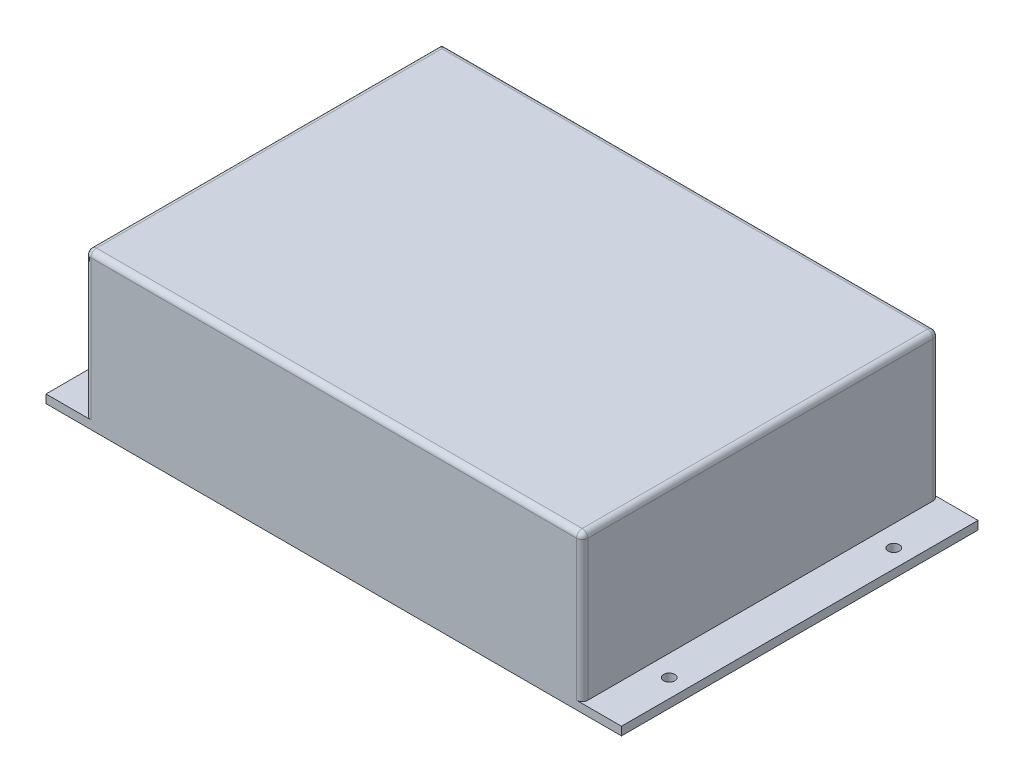
ISO-10303-21;
HEADER;
FILE_DESCRIPTION(('STEP AP214'),'2;1');
FILE_NAME('part.step','',(''),(''),'','','');
FILE_SCHEMA(('AUTOMOTIVE_DESIGN { 1 0 10303 214 1 1 1 1 }'));
ENDSEC;
DATA;
#1=APPLICATION_CONTEXT('core data for automotive mechanical design processes');
#2=APPLICATION_PROTOCOL_DEFINITION('international standard','automotive_design',2000,#1);
#3=PRODUCT_CONTEXT('',#1,'mechanical');
#4=PRODUCT('Part','Part','',(#3));
#5=PRODUCT_RELATED_PRODUCT_CATEGORY('part','',(#4));
#6=PRODUCT_DEFINITION_FORMATION('','',#4);
#7=PRODUCT_DEFINITION_CONTEXT('part definition',#1,'design');
#8=PRODUCT_DEFINITION('design','',#6,#7);
#9=PRODUCT_DEFINITION_SHAPE('','',#8);
#10=(LENGTH_UNIT() NAMED_UNIT(*) SI_UNIT(.MILLI.,.METRE.));
#11=(NAMED_UNIT(*) PLANE_ANGLE_UNIT() SI_UNIT($,.RADIAN.));
#12=(NAMED_UNIT(*) SI_UNIT($,.STERADIAN.) SOLID_ANGLE_UNIT());
#13=UNCERTAINTY_MEASURE_WITH_UNIT(LENGTH_MEASURE(1.E-05),#10,'distance_accuracy_value','');
#14=(GEOMETRIC_REPRESENTATION_CONTEXT(3) GLOBAL_UNCERTAINTY_ASSIGNED_CONTEXT((#13)) GLOBAL_UNIT_ASSIGNED_CONTEXT((#10,
#11,#12)) REPRESENTATION_CONTEXT('',''));
#15=CARTESIAN_POINT('',(0.,0.,0.));
#16=DIRECTION('',(0.,0.,1.));
#17=DIRECTION('',(1.,0.,0.));
#18=AXIS2_PLACEMENT_3D('',#15,#16,#17);
#19=CARTESIAN_POINT('',(0.,3.,0.));
#20=DIRECTION('',(0.,1.,0.));
#21=DIRECTION('',(0.,0.,1.));
#22=AXIS2_PLACEMENT_3D('',#19,#20,#21);
#23=PLANE('',#22);
#24=DIRECTION('',(0.,0.,1.));
#25=VECTOR('',#24,1.);
#26=CARTESIAN_POINT('',(-88.5,3.,-63.5));
#27=LINE('',#26,#25);
#28=CARTESIAN_POINT('',(-88.5,3.,-63.5));
#29=VERTEX_POINT('',#28);
#30=CARTESIAN_POINT('',(-88.5,3.,61.5));
#31=VERTEX_POINT('',#30);
#32=EDGE_CURVE('E259',#29,#31,#27,.T.);
#33=ORIENTED_EDGE('',*,*,#32,.F.);
#34=DIRECTION('',(-1.,0.,0.));
#35=VECTOR('',#34,1.);
#36=CARTESIAN_POINT('',(-102.5,3.,-63.5));
#37=LINE('',#36,#35);
#38=CARTESIAN_POINT('',(-102.5,3.,-63.5));
#39=VERTEX_POINT('',#38);
#40=EDGE_CURVE('E152',#29,#39,#37,.T.);
#41=ORIENTED_EDGE('',*,*,#40,.T.);
#42=DIRECTION('',(0.,0.,1.));
#43=VECTOR('',#42,1.);
#44=CARTESIAN_POINT('',(-102.5,3.,-63.5));
#45=LINE('',#44,#43);
#46=CARTESIAN_POINT('',(-102.5,3.,63.5));
#47=VERTEX_POINT('',#46);
#48=EDGE_CURVE('E149',#39,#47,#45,.T.);
#49=ORIENTED_EDGE('',*,*,#48,.T.);
#50=DIRECTION('',(1.,0.,0.));
#51=VECTOR('',#50,1.);
#52=CARTESIAN_POINT('',(-102.5,3.,63.5));
#53=LINE('',#52,#51);
#54=CARTESIAN_POINT('',(-86.5,3.,63.5));
#55=VERTEX_POINT('',#54);
#56=EDGE_CURVE('E136',#47,#55,#53,.T.);
#57=ORIENTED_EDGE('',*,*,#56,.T.);
#58=CARTESIAN_POINT('',(-86.5,3.,61.5));
#59=DIRECTION('',(0.,1.,0.));
#60=DIRECTION('',(0.,0.,1.));
#61=AXIS2_PLACEMENT_3D('',#58,#59,#60);
#62=CIRCLE('',#61,2.);
#63=EDGE_CURVE('E11',#55,#31,#62,.F.);
#64=ORIENTED_EDGE('',*,*,#63,.T.);
#65=EDGE_LOOP('',(#33,#41,#49,#57,#64));
#66=FACE_BOUND('',#65,.T.);
#67=CARTESIAN_POINT('',(-95.9999999999992,3.,40.));
#68=DIRECTION('',(0.,1.,0.));
#69=DIRECTION('',(0.,0.,1.));
#70=AXIS2_PLACEMENT_3D('',#67,#68,#69);
#71=CIRCLE('',#70,2.);
#72=CARTESIAN_POINT('',(-95.9999999999992,3.,42.));
#73=VERTEX_POINT('',#72);
#74=EDGE_CURVE('E273',#73,#73,#71,.T.);
#75=ORIENTED_EDGE('',*,*,#74,.F.);
#76=EDGE_LOOP('',(#75));
#77=FACE_BOUND('',#76,.T.);
#78=CARTESIAN_POINT('',(-96.,3.,-40.));
#79=DIRECTION('',(0.,1.,0.));
#80=DIRECTION('',(0.,0.,1.));
#81=AXIS2_PLACEMENT_3D('',#78,#79,#80);
#82=CIRCLE('',#81,2.);
#83=CARTESIAN_POINT('',(-96.,3.,-38.));
#84=VERTEX_POINT('',#83);
#85=EDGE_CURVE('E297',#84,#84,#82,.T.);
#86=ORIENTED_EDGE('',*,*,#85,.F.);
#87=EDGE_LOOP('',(#86));
#88=FACE_BOUND('',#87,.T.);
#89=ADVANCED_FACE('F39',(#66,#77,#88),#23,.T.);
#90=DIRECTION('',(0.,0.,-1.));
#91=VECTOR('',#90,1.);
#92=CARTESIAN_POINT('',(88.5,3.,-63.5));
#93=LINE('',#92,#91);
#94=CARTESIAN_POINT('',(88.5,3.,61.5));
#95=VERTEX_POINT('',#94);
#96=CARTESIAN_POINT('',(88.5,3.,-61.5));
#97=VERTEX_POINT('',#96);
#98=EDGE_CURVE('E263',#95,#97,#93,.T.);
#99=ORIENTED_EDGE('',*,*,#98,.F.);
#100=CARTESIAN_POINT('',(86.5,3.,61.5));
#101=DIRECTION('',(0.,1.,0.));
#102=DIRECTION('',(0.,0.,1.));
#103=AXIS2_PLACEMENT_3D('',#100,#101,#102);
#104=CIRCLE('',#103,2.);
#105=CARTESIAN_POINT('',(86.5,3.,63.5));
#106=VERTEX_POINT('',#105);
#107=EDGE_CURVE('E49',#95,#106,#104,.F.);
#108=ORIENTED_EDGE('',*,*,#107,.T.);
#109=CARTESIAN_POINT('',(102.5,3.,63.5));
#110=VERTEX_POINT('',#109);
#111=EDGE_CURVE('E146',#106,#110,#53,.T.);
#112=ORIENTED_EDGE('',*,*,#111,.T.);
#113=DIRECTION('',(0.,0.,-1.));
#114=VECTOR('',#113,1.);
#115=CARTESIAN_POINT('',(102.5,3.,-63.5));
#116=LINE('',#115,#114);
#117=CARTESIAN_POINT('',(102.5,3.,-63.5));
#118=VERTEX_POINT('',#117);
#119=EDGE_CURVE('E145',#110,#118,#116,.T.);
#120=ORIENTED_EDGE('',*,*,#119,.T.);
#121=CARTESIAN_POINT('',(86.4999999999999,3.,-63.5));
#122=VERTEX_POINT('',#121);
#123=EDGE_CURVE('E306',#118,#122,#37,.T.);
#124=ORIENTED_EDGE('',*,*,#123,.T.);
#125=CARTESIAN_POINT('',(86.5,3.,-61.5));
#126=DIRECTION('',(0.,1.,0.));
#127=DIRECTION('',(0.,0.,1.));
#128=AXIS2_PLACEMENT_3D('',#125,#126,#127);
#129=CIRCLE('',#128,2.);
#130=EDGE_CURVE('E214',#122,#97,#129,.F.);
#131=ORIENTED_EDGE('',*,*,#130,.T.);
#132=EDGE_LOOP('',(#99,#108,#112,#120,#124,#131));
#133=FACE_BOUND('',#132,.T.);
#134=CARTESIAN_POINT('',(96.0000000000008,3.,40.));
#135=DIRECTION('',(0.,1.,0.));
#136=DIRECTION('',(0.,0.,1.));
#137=AXIS2_PLACEMENT_3D('',#134,#135,#136);
#138=CIRCLE('',#137,2.);
#139=CARTESIAN_POINT('',(96.0000000000008,3.,42.));
#140=VERTEX_POINT('',#139);
#141=EDGE_CURVE('E281',#140,#140,#138,.T.);
#142=ORIENTED_EDGE('',*,*,#141,.F.);
#143=EDGE_LOOP('',(#142));
#144=FACE_BOUND('',#143,.T.);
#145=CARTESIAN_POINT('',(96.,3.,-40.));
#146=DIRECTION('',(0.,1.,0.));
#147=DIRECTION('',(0.,0.,1.));
#148=AXIS2_PLACEMENT_3D('',#145,#146,#147);
#149=CIRCLE('',#148,2.);
#150=CARTESIAN_POINT('',(96.,3.,-38.));
#151=VERTEX_POINT('',#150);
#152=EDGE_CURVE('E289',#151,#151,#149,.T.);
#153=ORIENTED_EDGE('',*,*,#152,.F.);
#154=EDGE_LOOP('',(#153));
#155=FACE_BOUND('',#154,.T.);
#156=ADVANCED_FACE('F339',(#133,#144,#155),#23,.T.);
#157=CARTESIAN_POINT('',(0.,0.,0.));
#158=DIRECTION('',(0.,1.,0.));
#159=DIRECTION('',(0.,0.,1.));
#160=AXIS2_PLACEMENT_3D('',#157,#158,#159);
#161=PLANE('',#160);
#162=DIRECTION('',(0.,0.,1.));
#163=VECTOR('',#162,1.);
#164=CARTESIAN_POINT('',(-102.5,0.,-63.5));
#165=LINE('',#164,#163);
#166=CARTESIAN_POINT('',(-102.5,0.,-63.5));
#167=VERTEX_POINT('',#166);
#168=CARTESIAN_POINT('',(-102.5,0.,63.5));
#169=VERTEX_POINT('',#168);
#170=EDGE_CURVE('E161',#167,#169,#165,.T.);
#171=ORIENTED_EDGE('',*,*,#170,.F.);
#172=DIRECTION('',(-1.,0.,0.));
#173=VECTOR('',#172,1.);
#174=CARTESIAN_POINT('',(-102.5,0.,-63.5));
#175=LINE('',#174,#173);
#176=CARTESIAN_POINT('',(102.5,0.,-63.5));
#177=VERTEX_POINT('',#176);
#178=EDGE_CURVE('E157',#177,#167,#175,.T.);
#179=ORIENTED_EDGE('',*,*,#178,.F.);
#180=DIRECTION('',(0.,0.,-1.));
#181=VECTOR('',#180,1.);
#182=CARTESIAN_POINT('',(102.5,0.,-63.5));
#183=LINE('',#182,#181);
#184=CARTESIAN_POINT('',(102.5,0.,63.5));
#185=VERTEX_POINT('',#184);
#186=EDGE_CURVE('E315',#185,#177,#183,.T.);
#187=ORIENTED_EDGE('',*,*,#186,.F.);
#188=DIRECTION('',(1.,0.,0.));
#189=VECTOR('',#188,1.);
#190=CARTESIAN_POINT('',(-102.5,0.,63.5));
#191=LINE('',#190,#189);
#192=EDGE_CURVE('E312',#169,#185,#191,.T.);
#193=ORIENTED_EDGE('',*,*,#192,.F.);
#194=EDGE_LOOP('',(#171,#179,#187,#193));
#195=FACE_BOUND('',#194,.T.);
#196=CARTESIAN_POINT('',(-96.,0.,-40.));
#197=DIRECTION('',(0.,1.,0.));
#198=DIRECTION('',(0.,0.,1.));
#199=AXIS2_PLACEMENT_3D('',#196,#197,#198);
#200=CIRCLE('',#199,2.);
#201=CARTESIAN_POINT('',(-96.,0.,-38.));
#202=VERTEX_POINT('',#201);
#203=EDGE_CURVE('E293',#202,#202,#200,.T.);
#204=ORIENTED_EDGE('',*,*,#203,.T.);
#205=EDGE_LOOP('',(#204));
#206=FACE_BOUND('',#205,.T.);
#207=CARTESIAN_POINT('',(96.,0.,-40.));
#208=DIRECTION('',(0.,1.,0.));
#209=DIRECTION('',(0.,0.,1.));
#210=AXIS2_PLACEMENT_3D('',#207,#208,#209);
#211=CIRCLE('',#210,2.);
#212=CARTESIAN_POINT('',(96.,0.,-38.));
#213=VERTEX_POINT('',#212);
#214=EDGE_CURVE('E285',#213,#213,#211,.T.);
#215=ORIENTED_EDGE('',*,*,#214,.T.);
#216=EDGE_LOOP('',(#215));
#217=FACE_BOUND('',#216,.T.);
#218=CARTESIAN_POINT('',(96.0000000000008,0.,40.));
#219=DIRECTION('',(0.,1.,0.));
#220=DIRECTION('',(0.,0.,1.));
#221=AXIS2_PLACEMENT_3D('',#218,#219,#220);
#222=CIRCLE('',#221,2.);
#223=CARTESIAN_POINT('',(96.0000000000008,0.,42.));
#224=VERTEX_POINT('',#223);
#225=EDGE_CURVE('E277',#224,#224,#222,.T.);
#226=ORIENTED_EDGE('',*,*,#225,.T.);
#227=EDGE_LOOP('',(#226));
#228=FACE_BOUND('',#227,.T.);
#229=CARTESIAN_POINT('',(-95.9999999999992,0.,40.));
#230=DIRECTION('',(0.,1.,0.));
#231=DIRECTION('',(0.,0.,1.));
#232=AXIS2_PLACEMENT_3D('',#229,#230,#231);
#233=CIRCLE('',#232,2.);
#234=CARTESIAN_POINT('',(-95.9999999999992,0.,42.));
#235=VERTEX_POINT('',#234);
#236=EDGE_CURVE('E272',#235,#235,#233,.T.);
#237=ORIENTED_EDGE('',*,*,#236,.T.);
#238=EDGE_LOOP('',(#237));
#239=FACE_BOUND('',#238,.T.);
#240=ADVANCED_FACE('F333',(#195,#206,#217,#228,#239),#161,.F.);
#241=CARTESIAN_POINT('',(-102.5,3.,-63.5));
#242=DIRECTION('',(1.,0.,0.));
#243=DIRECTION('',(0.,0.,-1.));
#244=AXIS2_PLACEMENT_3D('',#241,#242,#243);
#245=PLANE('',#244);
#246=ORIENTED_EDGE('',*,*,#170,.T.);
#247=DIRECTION('',(0.,-1.,0.));
#248=VECTOR('',#247,1.);
#249=CARTESIAN_POINT('',(-102.5,3.,63.5));
#250=LINE('',#249,#248);
#251=EDGE_CURVE('E140',#47,#169,#250,.T.);
#252=ORIENTED_EDGE('',*,*,#251,.F.);
#253=ORIENTED_EDGE('',*,*,#48,.F.);
#254=DIRECTION('',(0.,-1.,0.));
#255=VECTOR('',#254,1.);
#256=CARTESIAN_POINT('',(-102.5,3.,-63.5));
#257=LINE('',#256,#255);
#258=EDGE_CURVE('E309',#39,#167,#257,.T.);
#259=ORIENTED_EDGE('',*,*,#258,.T.);
#260=EDGE_LOOP('',(#246,#252,#253,#259));
#261=FACE_BOUND('',#260,.T.);
#262=ADVANCED_FACE('F159',(#261),#245,.F.);
#263=CARTESIAN_POINT('',(-102.5,3.,63.5));
#264=DIRECTION('',(0.,0.,-1.));
#265=DIRECTION('',(-1.,0.,0.));
#266=AXIS2_PLACEMENT_3D('',#263,#264,#265);
#267=PLANE('',#266);
#268=ORIENTED_EDGE('',*,*,#111,.F.);
#269=DIRECTION('',(0.,-1.,0.));
#270=VECTOR('',#269,1.);
#271=CARTESIAN_POINT('',(86.5,3.,63.5));
#272=LINE('',#271,#270);
#273=CARTESIAN_POINT('',(86.5,53.,63.5));
#274=VERTEX_POINT('',#273);
#275=EDGE_CURVE('E206',#106,#274,#272,.F.);
#276=ORIENTED_EDGE('',*,*,#275,.T.);
#277=DIRECTION('',(1.,0.,0.));
#278=VECTOR('',#277,1.);
#279=CARTESIAN_POINT('',(-88.5,53.,63.5));
#280=LINE('',#279,#278);
#281=CARTESIAN_POINT('',(-86.5,53.,63.5));
#282=VERTEX_POINT('',#281);
#283=EDGE_CURVE('E203',#274,#282,#280,.F.);
#284=ORIENTED_EDGE('',*,*,#283,.T.);
#285=DIRECTION('',(0.,-1.,0.));
#286=VECTOR('',#285,1.);
#287=CARTESIAN_POINT('',(-86.5,3.,63.5));
#288=LINE('',#287,#286);
#289=EDGE_CURVE('E143',#282,#55,#288,.T.);
#290=ORIENTED_EDGE('',*,*,#289,.T.);
#291=ORIENTED_EDGE('',*,*,#56,.F.);
#292=ORIENTED_EDGE('',*,*,#251,.T.);
#293=ORIENTED_EDGE('',*,*,#192,.T.);
#294=DIRECTION('',(0.,-1.,0.));
#295=VECTOR('',#294,1.);
#296=CARTESIAN_POINT('',(102.5,3.,63.5));
#297=LINE('',#296,#295);
#298=EDGE_CURVE('E164',#110,#185,#297,.T.);
#299=ORIENTED_EDGE('',*,*,#298,.F.);
#300=EDGE_LOOP('',(#268,#276,#284,#290,#291,#292,#293,#299));
#301=FACE_BOUND('',#300,.T.);
#302=ADVANCED_FACE('F138',(#301),#267,.F.);
#303=CARTESIAN_POINT('',(102.5,3.,-63.5));
#304=DIRECTION('',(-1.,0.,0.));
#305=DIRECTION('',(0.,0.,1.));
#306=AXIS2_PLACEMENT_3D('',#303,#304,#305);
#307=PLANE('',#306);
#308=ORIENTED_EDGE('',*,*,#186,.T.);
#309=DIRECTION('',(0.,-1.,0.));
#310=VECTOR('',#309,1.);
#311=CARTESIAN_POINT('',(102.5,3.,-63.5));
#312=LINE('',#311,#310);
#313=EDGE_CURVE('E171',#118,#177,#312,.T.);
#314=ORIENTED_EDGE('',*,*,#313,.F.);
#315=ORIENTED_EDGE('',*,*,#119,.F.);
#316=ORIENTED_EDGE('',*,*,#298,.T.);
#317=EDGE_LOOP('',(#308,#314,#315,#316));
#318=FACE_BOUND('',#317,.T.);
#319=ADVANCED_FACE('F336',(#318),#307,.F.);
#320=CARTESIAN_POINT('',(-102.5,3.,-63.5));
#321=DIRECTION('',(0.,0.,1.));
#322=DIRECTION('',(1.,0.,0.));
#323=AXIS2_PLACEMENT_3D('',#320,#321,#322);
#324=PLANE('',#323);
#325=DIRECTION('',(0.,-1.,0.));
#326=VECTOR('',#325,1.);
#327=CARTESIAN_POINT('',(-88.5,55.,-63.5));
#328=LINE('',#327,#326);
#329=CARTESIAN_POINT('',(-88.5,53.,-63.5));
#330=VERTEX_POINT('',#329);
#331=EDGE_CURVE('E267',#330,#29,#328,.T.);
#332=ORIENTED_EDGE('',*,*,#331,.F.);
#333=DIRECTION('',(-1.,0.,0.));
#334=VECTOR('',#333,1.);
#335=CARTESIAN_POINT('',(88.5,53.,-63.5));
#336=LINE('',#335,#334);
#337=CARTESIAN_POINT('',(86.5,53.,-63.5));
#338=VERTEX_POINT('',#337);
#339=EDGE_CURVE('E188',#330,#338,#336,.F.);
#340=ORIENTED_EDGE('',*,*,#339,.T.);
#341=DIRECTION('',(0.,-1.,0.));
#342=VECTOR('',#341,1.);
#343=CARTESIAN_POINT('',(86.5,3.,-63.5));
#344=LINE('',#343,#342);
#345=EDGE_CURVE('E184',#338,#122,#344,.T.);
#346=ORIENTED_EDGE('',*,*,#345,.T.);
#347=ORIENTED_EDGE('',*,*,#123,.F.);
#348=ORIENTED_EDGE('',*,*,#313,.T.);
#349=ORIENTED_EDGE('',*,*,#178,.T.);
#350=ORIENTED_EDGE('',*,*,#258,.F.);
#351=ORIENTED_EDGE('',*,*,#40,.F.);
#352=EDGE_LOOP('',(#332,#340,#346,#347,#348,#349,#350,#351));
#353=FACE_BOUND('',#352,.T.);
#354=ADVANCED_FACE('F328',(#353),#324,.F.);
#355=CARTESIAN_POINT('',(-96.,3.,-40.));
#356=DIRECTION('',(0.,-1.,0.));
#357=DIRECTION('',(0.,0.,-1.));
#358=AXIS2_PLACEMENT_3D('',#355,#356,#357);
#359=CYLINDRICAL_SURFACE('',#358,2.);
#360=ORIENTED_EDGE('',*,*,#85,.T.);
#361=EDGE_LOOP('',(#360));
#362=FACE_BOUND('',#361,.T.);
#363=ORIENTED_EDGE('',*,*,#203,.F.);
#364=EDGE_LOOP('',(#363));
#365=FACE_BOUND('',#364,.T.);
#366=ADVANCED_FACE('F375',(#362,#365),#359,.F.);
#367=CARTESIAN_POINT('',(96.,3.,-40.));
#368=DIRECTION('',(0.,-1.,0.));
#369=DIRECTION('',(0.,0.,-1.));
#370=AXIS2_PLACEMENT_3D('',#367,#368,#369);
#371=CYLINDRICAL_SURFACE('',#370,2.);
#372=ORIENTED_EDGE('',*,*,#152,.T.);
#373=EDGE_LOOP('',(#372));
#374=FACE_BOUND('',#373,.T.);
#375=ORIENTED_EDGE('',*,*,#214,.F.);
#376=EDGE_LOOP('',(#375));
#377=FACE_BOUND('',#376,.T.);
#378=ADVANCED_FACE('F436',(#374,#377),#371,.F.);
#379=CARTESIAN_POINT('',(96.0000000000008,3.,40.));
#380=DIRECTION('',(0.,-1.,0.));
#381=DIRECTION('',(0.,0.,-1.));
#382=AXIS2_PLACEMENT_3D('',#379,#380,#381);
#383=CYLINDRICAL_SURFACE('',#382,2.);
#384=ORIENTED_EDGE('',*,*,#141,.T.);
#385=EDGE_LOOP('',(#384));
#386=FACE_BOUND('',#385,.T.);
#387=ORIENTED_EDGE('',*,*,#225,.F.);
#388=EDGE_LOOP('',(#387));
#389=FACE_BOUND('',#388,.T.);
#390=ADVANCED_FACE('F433',(#386,#389),#383,.F.);
#391=CARTESIAN_POINT('',(-95.9999999999992,3.,40.));
#392=DIRECTION('',(0.,-1.,0.));
#393=DIRECTION('',(0.,0.,-1.));
#394=AXIS2_PLACEMENT_3D('',#391,#392,#393);
#395=CYLINDRICAL_SURFACE('',#394,2.);
#396=ORIENTED_EDGE('',*,*,#74,.T.);
#397=EDGE_LOOP('',(#396));
#398=FACE_BOUND('',#397,.T.);
#399=ORIENTED_EDGE('',*,*,#236,.F.);
#400=EDGE_LOOP('',(#399));
#401=FACE_BOUND('',#400,.T.);
#402=ADVANCED_FACE('F428',(#398,#401),#395,.F.);
#403=CARTESIAN_POINT('',(-88.5,55.,-63.5));
#404=DIRECTION('',(1.,0.,0.));
#405=DIRECTION('',(0.,0.,-1.));
#406=AXIS2_PLACEMENT_3D('',#403,#404,#405);
#407=PLANE('',#406);
#408=ORIENTED_EDGE('',*,*,#32,.T.);
#409=DIRECTION('',(0.,-1.,0.));
#410=VECTOR('',#409,1.);
#411=CARTESIAN_POINT('',(-88.5,55.,61.5));
#412=LINE('',#411,#410);
#413=CARTESIAN_POINT('',(-88.5,53.,61.5));
#414=VERTEX_POINT('',#413);
#415=EDGE_CURVE('E57',#31,#414,#412,.F.);
#416=ORIENTED_EDGE('',*,*,#415,.T.);
#417=DIRECTION('',(0.,0.,1.));
#418=VECTOR('',#417,1.);
#419=CARTESIAN_POINT('',(-88.5,53.,-63.5));
#420=LINE('',#419,#418);
#421=EDGE_CURVE('E209',#414,#330,#420,.F.);
#422=ORIENTED_EDGE('',*,*,#421,.T.);
#423=ORIENTED_EDGE('',*,*,#331,.T.);
#424=EDGE_LOOP('',(#408,#416,#422,#423));
#425=FACE_BOUND('',#424,.T.);
#426=ADVANCED_FACE('F414',(#425),#407,.F.);
#427=CARTESIAN_POINT('',(88.5,55.,-63.5));
#428=DIRECTION('',(-1.,0.,0.));
#429=DIRECTION('',(0.,0.,1.));
#430=AXIS2_PLACEMENT_3D('',#427,#428,#429);
#431=PLANE('',#430);
#432=ORIENTED_EDGE('',*,*,#98,.T.);
#433=DIRECTION('',(0.,-1.,0.));
#434=VECTOR('',#433,1.);
#435=CARTESIAN_POINT('',(88.5,55.,-61.5));
#436=LINE('',#435,#434);
#437=CARTESIAN_POINT('',(88.5,53.,-61.5));
#438=VERTEX_POINT('',#437);
#439=EDGE_CURVE('E198',#97,#438,#436,.F.);
#440=ORIENTED_EDGE('',*,*,#439,.T.);
#441=DIRECTION('',(0.,0.,-1.));
#442=VECTOR('',#441,1.);
#443=CARTESIAN_POINT('',(88.5,53.,63.5));
#444=LINE('',#443,#442);
#445=CARTESIAN_POINT('',(88.5,53.,61.5));
#446=VERTEX_POINT('',#445);
#447=EDGE_CURVE('E195',#438,#446,#444,.F.);
#448=ORIENTED_EDGE('',*,*,#447,.T.);
#449=DIRECTION('',(0.,-1.,0.));
#450=VECTOR('',#449,1.);
#451=CARTESIAN_POINT('',(88.5,55.,61.5));
#452=LINE('',#451,#450);
#453=EDGE_CURVE('E192',#446,#95,#452,.T.);
#454=ORIENTED_EDGE('',*,*,#453,.T.);
#455=EDGE_LOOP('',(#432,#440,#448,#454));
#456=FACE_BOUND('',#455,.T.);
#457=ADVANCED_FACE('F420',(#456),#431,.F.);
#458=CARTESIAN_POINT('',(0.,55.,0.));
#459=DIRECTION('',(0.,1.,0.));
#460=DIRECTION('',(0.,0.,1.));
#461=AXIS2_PLACEMENT_3D('',#458,#459,#460);
#462=PLANE('',#461);
#463=DIRECTION('',(0.,0.,-1.));
#464=VECTOR('',#463,1.);
#465=CARTESIAN_POINT('',(86.5,55.,-63.5));
#466=LINE('',#465,#464);
#467=CARTESIAN_POINT('',(86.5,55.,61.5));
#468=VERTEX_POINT('',#467);
#469=CARTESIAN_POINT('',(86.5,55.,-61.5));
#470=VERTEX_POINT('',#469);
#471=EDGE_CURVE('E177',#468,#470,#466,.T.);
#472=ORIENTED_EDGE('',*,*,#471,.T.);
#473=DIRECTION('',(-1.,0.,0.));
#474=VECTOR('',#473,1.);
#475=CARTESIAN_POINT('',(-88.5,55.,-61.5));
#476=LINE('',#475,#474);
#477=CARTESIAN_POINT('',(-86.5,55.,-61.5));
#478=VERTEX_POINT('',#477);
#479=EDGE_CURVE('E180',#470,#478,#476,.T.);
#480=ORIENTED_EDGE('',*,*,#479,.T.);
#481=DIRECTION('',(0.,0.,1.));
#482=VECTOR('',#481,1.);
#483=CARTESIAN_POINT('',(-86.5,55.,63.5));
#484=LINE('',#483,#482);
#485=CARTESIAN_POINT('',(-86.5,55.,61.5));
#486=VERTEX_POINT('',#485);
#487=EDGE_CURVE('E163',#478,#486,#484,.T.);
#488=ORIENTED_EDGE('',*,*,#487,.T.);
#489=DIRECTION('',(1.,0.,0.));
#490=VECTOR('',#489,1.);
#491=CARTESIAN_POINT('',(88.5,55.,61.5));
#492=LINE('',#491,#490);
#493=EDGE_CURVE('E168',#486,#468,#492,.T.);
#494=ORIENTED_EDGE('',*,*,#493,.T.);
#495=EDGE_LOOP('',(#472,#480,#488,#494));
#496=FACE_BOUND('',#495,.T.);
#497=ADVANCED_FACE('F410',(#496),#462,.T.);
#498=CARTESIAN_POINT('',(86.5,55.,61.5));
#499=DIRECTION('',(0.,-1.,0.));
#500=DIRECTION('',(0.,0.,-1.));
#501=AXIS2_PLACEMENT_3D('',#498,#499,#500);
#502=CYLINDRICAL_SURFACE('',#501,2.);
#503=CARTESIAN_POINT('',(86.5,53.,61.5));
#504=DIRECTION('',(0.,1.,0.));
#505=DIRECTION('',(0.,0.,1.));
#506=AXIS2_PLACEMENT_3D('',#503,#504,#505);
#507=CIRCLE('',#506,2.);
#508=EDGE_CURVE('E43',#274,#446,#507,.T.);
#509=ORIENTED_EDGE('',*,*,#508,.F.);
#510=ORIENTED_EDGE('',*,*,#275,.F.);
#511=ORIENTED_EDGE('',*,*,#107,.F.);
#512=ORIENTED_EDGE('',*,*,#453,.F.);
#513=EDGE_LOOP('',(#509,#510,#511,#512));
#514=FACE_BOUND('',#513,.T.);
#515=ADVANCED_FACE('F41',(#514),#502,.T.);
#516=CARTESIAN_POINT('',(86.5,53.,61.5));
#517=DIRECTION('',(0.,0.,1.));
#518=DIRECTION('',(1.,0.,0.));
#519=AXIS2_PLACEMENT_3D('',#516,#517,#518);
#520=SPHERICAL_SURFACE('',#519,2.);
#521=CARTESIAN_POINT('',(86.5,53.,61.5));
#522=DIRECTION('',(0.,0.,1.));
#523=DIRECTION('',(1.,0.,0.));
#524=AXIS2_PLACEMENT_3D('',#521,#522,#523);
#525=CIRCLE('',#524,2.);
#526=EDGE_CURVE('E246',#468,#446,#525,.F.);
#527=ORIENTED_EDGE('',*,*,#526,.F.);
#528=CARTESIAN_POINT('',(86.5,53.,61.5));
#529=DIRECTION('',(1.,0.,0.));
#530=DIRECTION('',(0.,0.,-1.));
#531=AXIS2_PLACEMENT_3D('',#528,#529,#530);
#532=CIRCLE('',#531,2.);
#533=EDGE_CURVE('E249',#274,#468,#532,.F.);
#534=ORIENTED_EDGE('',*,*,#533,.F.);
#535=ORIENTED_EDGE('',*,*,#508,.T.);
#536=EDGE_LOOP('',(#527,#534,#535));
#537=FACE_BOUND('',#536,.T.);
#538=ADVANCED_FACE('F347',(#537),#520,.T.);
#539=CARTESIAN_POINT('',(0.,53.,61.5));
#540=DIRECTION('',(-1.,0.,0.));
#541=DIRECTION('',(0.,0.,1.));
#542=AXIS2_PLACEMENT_3D('',#539,#540,#541);
#543=CYLINDRICAL_SURFACE('',#542,2.);
#544=ORIENTED_EDGE('',*,*,#533,.T.);
#545=ORIENTED_EDGE('',*,*,#493,.F.);
#546=CARTESIAN_POINT('',(-86.5,53.,61.5));
#547=DIRECTION('',(-1.,0.,0.));
#548=DIRECTION('',(0.,0.,1.));
#549=AXIS2_PLACEMENT_3D('',#546,#547,#548);
#550=CIRCLE('',#549,2.);
#551=EDGE_CURVE('E242',#282,#486,#550,.T.);
#552=ORIENTED_EDGE('',*,*,#551,.F.);
#553=ORIENTED_EDGE('',*,*,#283,.F.);
#554=EDGE_LOOP('',(#544,#545,#552,#553));
#555=FACE_BOUND('',#554,.T.);
#556=ADVANCED_FACE('F350',(#555),#543,.T.);
#557=CARTESIAN_POINT('',(-86.5,3.,61.5));
#558=DIRECTION('',(0.,-1.,0.));
#559=DIRECTION('',(0.,0.,-1.));
#560=AXIS2_PLACEMENT_3D('',#557,#558,#559);
#561=CYLINDRICAL_SURFACE('',#560,2.);
#562=ORIENTED_EDGE('',*,*,#63,.F.);
#563=ORIENTED_EDGE('',*,*,#289,.F.);
#564=CARTESIAN_POINT('',(-86.5,53.,61.5));
#565=DIRECTION('',(0.,1.,0.));
#566=DIRECTION('',(0.,0.,1.));
#567=AXIS2_PLACEMENT_3D('',#564,#565,#566);
#568=CIRCLE('',#567,2.);
#569=EDGE_CURVE('E238',#414,#282,#568,.T.);
#570=ORIENTED_EDGE('',*,*,#569,.F.);
#571=ORIENTED_EDGE('',*,*,#415,.F.);
#572=EDGE_LOOP('',(#562,#563,#570,#571));
#573=FACE_BOUND('',#572,.T.);
#574=ADVANCED_FACE('F356',(#573),#561,.T.);
#575=CARTESIAN_POINT('',(86.5,3.,-61.5));
#576=DIRECTION('',(0.,-1.,0.));
#577=DIRECTION('',(0.,0.,-1.));
#578=AXIS2_PLACEMENT_3D('',#575,#576,#577);
#579=CYLINDRICAL_SURFACE('',#578,2.);
#580=ORIENTED_EDGE('',*,*,#130,.F.);
#581=ORIENTED_EDGE('',*,*,#345,.F.);
#582=CARTESIAN_POINT('',(86.5,53.,-61.5));
#583=DIRECTION('',(0.,1.,0.));
#584=DIRECTION('',(0.,0.,1.));
#585=AXIS2_PLACEMENT_3D('',#582,#583,#584);
#586=CIRCLE('',#585,2.);
#587=EDGE_CURVE('E234',#438,#338,#586,.T.);
#588=ORIENTED_EDGE('',*,*,#587,.F.);
#589=ORIENTED_EDGE('',*,*,#439,.F.);
#590=EDGE_LOOP('',(#580,#581,#588,#589));
#591=FACE_BOUND('',#590,.T.);
#592=ADVANCED_FACE('F358',(#591),#579,.T.);
#593=CARTESIAN_POINT('',(86.5,53.,0.));
#594=DIRECTION('',(0.,0.,1.));
#595=DIRECTION('',(1.,0.,0.));
#596=AXIS2_PLACEMENT_3D('',#593,#594,#595);
#597=CYLINDRICAL_SURFACE('',#596,2.);
#598=ORIENTED_EDGE('',*,*,#526,.T.);
#599=ORIENTED_EDGE('',*,*,#447,.F.);
#600=CARTESIAN_POINT('',(86.5,53.,-61.5));
#601=DIRECTION('',(0.,0.,-1.));
#602=DIRECTION('',(-1.,0.,0.));
#603=AXIS2_PLACEMENT_3D('',#600,#601,#602);
#604=CIRCLE('',#603,2.);
#605=EDGE_CURVE('E230',#470,#438,#604,.T.);
#606=ORIENTED_EDGE('',*,*,#605,.F.);
#607=ORIENTED_EDGE('',*,*,#471,.F.);
#608=EDGE_LOOP('',(#598,#599,#606,#607));
#609=FACE_BOUND('',#608,.T.);
#610=ADVANCED_FACE('F364',(#609),#597,.T.);
#611=CARTESIAN_POINT('',(-86.5,53.,61.5));
#612=DIRECTION('',(0.,0.,1.));
#613=DIRECTION('',(1.,0.,0.));
#614=AXIS2_PLACEMENT_3D('',#611,#612,#613);
#615=SPHERICAL_SURFACE('',#614,2.);
#616=ORIENTED_EDGE('',*,*,#569,.T.);
#617=ORIENTED_EDGE('',*,*,#551,.T.);
#618=CARTESIAN_POINT('',(-86.5,53.,61.5));
#619=DIRECTION('',(0.,0.,1.));
#620=DIRECTION('',(1.,0.,0.));
#621=AXIS2_PLACEMENT_3D('',#618,#619,#620);
#622=CIRCLE('',#621,2.);
#623=EDGE_CURVE('E226',#414,#486,#622,.F.);
#624=ORIENTED_EDGE('',*,*,#623,.F.);
#625=EDGE_LOOP('',(#616,#617,#624));
#626=FACE_BOUND('',#625,.T.);
#627=ADVANCED_FACE('F353',(#626),#615,.T.);
#628=CARTESIAN_POINT('',(86.5,53.,-61.5));
#629=DIRECTION('',(0.,0.,1.));
#630=DIRECTION('',(1.,0.,0.));
#631=AXIS2_PLACEMENT_3D('',#628,#629,#630);
#632=SPHERICAL_SURFACE('',#631,2.);
#633=ORIENTED_EDGE('',*,*,#605,.T.);
#634=ORIENTED_EDGE('',*,*,#587,.T.);
#635=CARTESIAN_POINT('',(86.5,53.,-61.5));
#636=DIRECTION('',(1.,0.,0.));
#637=DIRECTION('',(0.,0.,-1.));
#638=AXIS2_PLACEMENT_3D('',#635,#636,#637);
#639=CIRCLE('',#638,2.);
#640=EDGE_CURVE('E223',#470,#338,#639,.F.);
#641=ORIENTED_EDGE('',*,*,#640,.F.);
#642=EDGE_LOOP('',(#633,#634,#641));
#643=FACE_BOUND('',#642,.T.);
#644=ADVANCED_FACE('F394',(#643),#632,.T.);
#645=CARTESIAN_POINT('',(-86.5,53.,0.));
#646=DIRECTION('',(0.,0.,-1.));
#647=DIRECTION('',(-1.,0.,0.));
#648=AXIS2_PLACEMENT_3D('',#645,#646,#647);
#649=CYLINDRICAL_SURFACE('',#648,2.);
#650=ORIENTED_EDGE('',*,*,#623,.T.);
#651=ORIENTED_EDGE('',*,*,#487,.F.);
#652=CARTESIAN_POINT('',(-86.5,53.,-61.5));
#653=DIRECTION('',(0.707106781186547,0.,-0.707106781186548));
#654=DIRECTION('',(-0.707106781186548,0.,-0.707106781186547));
#655=AXIS2_PLACEMENT_3D('',#652,#653,#654);
#656=ELLIPSE('',#655,2.82842712474619,2.);
#657=EDGE_CURVE('E220',#330,#478,#656,.T.);
#658=ORIENTED_EDGE('',*,*,#657,.F.);
#659=ORIENTED_EDGE('',*,*,#421,.F.);
#660=EDGE_LOOP('',(#650,#651,#658,#659));
#661=FACE_BOUND('',#660,.T.);
#662=ADVANCED_FACE('F390',(#661),#649,.T.);
#663=CARTESIAN_POINT('',(0.,53.,-61.5));
#664=DIRECTION('',(1.,0.,0.));
#665=DIRECTION('',(0.,0.,-1.));
#666=AXIS2_PLACEMENT_3D('',#663,#664,#665);
#667=CYLINDRICAL_SURFACE('',#666,2.);
#668=ORIENTED_EDGE('',*,*,#640,.T.);
#669=ORIENTED_EDGE('',*,*,#339,.F.);
#670=ORIENTED_EDGE('',*,*,#657,.T.);
#671=ORIENTED_EDGE('',*,*,#479,.F.);
#672=EDGE_LOOP('',(#668,#669,#670,#671));
#673=FACE_BOUND('',#672,.T.);
#674=ADVANCED_FACE('F387',(#673),#667,.T.);
#675=CLOSED_SHELL('',(#89,#156,#240,#262,#302,#319,#354,#366,#378,#390,#402,#426,#457,#497,#515,
#538,#556,#574,#592,#610,#627,#644,#662,#674));
#676=MANIFOLD_SOLID_BREP('B2',#675);
#677=ADVANCED_BREP_SHAPE_REPRESENTATION('',(#18,#676),#14);
#678=SHAPE_DEFINITION_REPRESENTATION(#9,#677);
ENDSEC;
END-ISO-10303-21;
